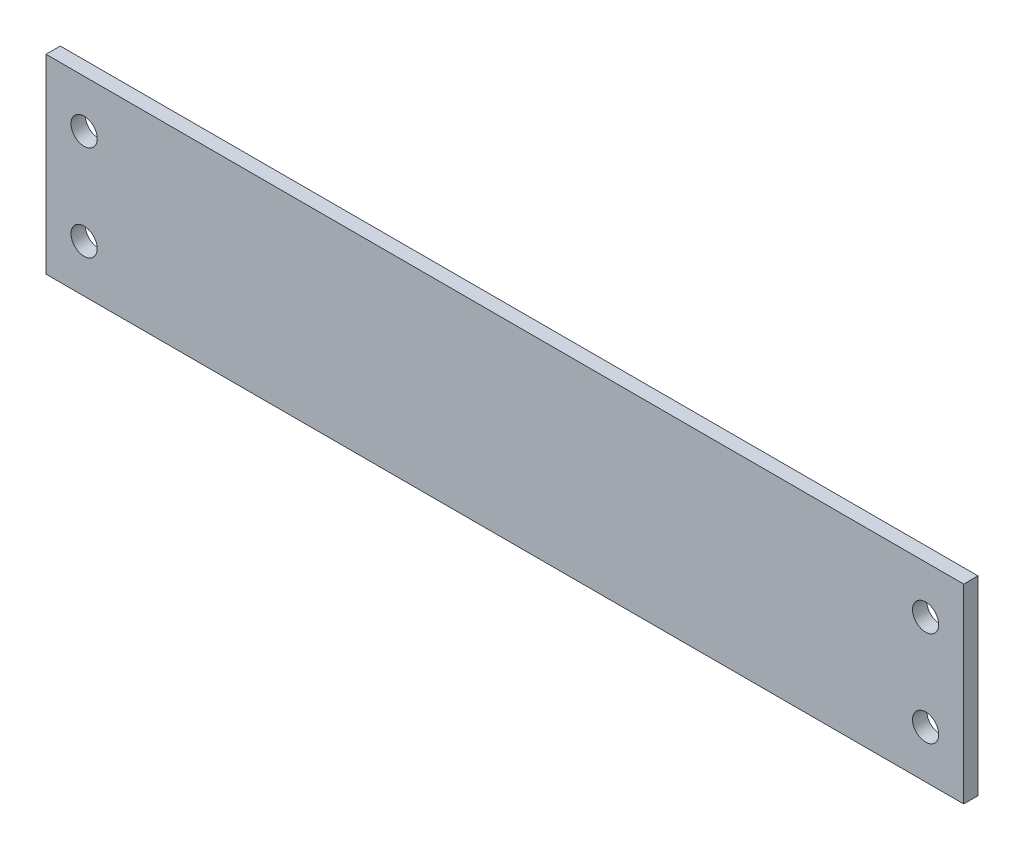
ISO-10303-21;
HEADER;
FILE_DESCRIPTION(('STEP AP214'),'2;1');
FILE_NAME('part.step','',(''),(''),'','','');
FILE_SCHEMA(('AUTOMOTIVE_DESIGN { 1 0 10303 214 1 1 1 1 }'));
ENDSEC;
DATA;
#1=APPLICATION_CONTEXT('core data for automotive mechanical design processes');
#2=APPLICATION_PROTOCOL_DEFINITION('international standard','automotive_design',2000,#1);
#3=PRODUCT_CONTEXT('',#1,'mechanical');
#4=PRODUCT('Part','Part','',(#3));
#5=PRODUCT_RELATED_PRODUCT_CATEGORY('part','',(#4));
#6=PRODUCT_DEFINITION_FORMATION('','',#4);
#7=PRODUCT_DEFINITION_CONTEXT('part definition',#1,'design');
#8=PRODUCT_DEFINITION('design','',#6,#7);
#9=PRODUCT_DEFINITION_SHAPE('','',#8);
#10=(LENGTH_UNIT() NAMED_UNIT(*) SI_UNIT(.MILLI.,.METRE.));
#11=(NAMED_UNIT(*) PLANE_ANGLE_UNIT() SI_UNIT($,.RADIAN.));
#12=(NAMED_UNIT(*) SI_UNIT($,.STERADIAN.) SOLID_ANGLE_UNIT());
#13=UNCERTAINTY_MEASURE_WITH_UNIT(LENGTH_MEASURE(1.E-05),#10,'distance_accuracy_value','');
#14=(GEOMETRIC_REPRESENTATION_CONTEXT(3) GLOBAL_UNCERTAINTY_ASSIGNED_CONTEXT((#13)) GLOBAL_UNIT_ASSIGNED_CONTEXT((#10,
#11,#12)) REPRESENTATION_CONTEXT('',''));
#15=CARTESIAN_POINT('',(0.,0.,0.));
#16=DIRECTION('',(0.,0.,1.));
#17=DIRECTION('',(1.,0.,0.));
#18=AXIS2_PLACEMENT_3D('',#15,#16,#17);
#19=CARTESIAN_POINT('',(-192.75,40.,3.));
#20=DIRECTION('',(0.,-1.,0.));
#21=DIRECTION('',(1.,0.,0.));
#22=AXIS2_PLACEMENT_3D('',#19,#20,#21);
#23=PLANE('',#22);
#24=DIRECTION('',(-1.,0.,0.));
#25=VECTOR('',#24,1.);
#26=CARTESIAN_POINT('',(-192.75,40.,0.));
#27=LINE('',#26,#25);
#28=CARTESIAN_POINT('',(0.,40.,0.));
#29=VERTEX_POINT('',#28);
#30=CARTESIAN_POINT('',(-192.75,40.,0.));
#31=VERTEX_POINT('',#30);
#32=EDGE_CURVE('E97',#29,#31,#27,.T.);
#33=ORIENTED_EDGE('',*,*,#32,.T.);
#34=DIRECTION('',(0.,0.,-1.));
#35=VECTOR('',#34,1.);
#36=CARTESIAN_POINT('',(-192.75,40.,3.));
#37=LINE('',#36,#35);
#38=CARTESIAN_POINT('',(-192.75,40.,3.));
#39=VERTEX_POINT('',#38);
#40=EDGE_CURVE('E11',#39,#31,#37,.T.);
#41=ORIENTED_EDGE('',*,*,#40,.F.);
#42=DIRECTION('',(-1.,0.,0.));
#43=VECTOR('',#42,1.);
#44=CARTESIAN_POINT('',(-192.75,40.,3.));
#45=LINE('',#44,#43);
#46=CARTESIAN_POINT('',(0.,40.,3.));
#47=VERTEX_POINT('',#46);
#48=EDGE_CURVE('E85',#47,#39,#45,.T.);
#49=ORIENTED_EDGE('',*,*,#48,.F.);
#50=DIRECTION('',(0.,0.,-1.));
#51=VECTOR('',#50,1.);
#52=CARTESIAN_POINT('',(0.,40.,3.));
#53=LINE('',#52,#51);
#54=EDGE_CURVE('E93',#47,#29,#53,.T.);
#55=ORIENTED_EDGE('',*,*,#54,.T.);
#56=EDGE_LOOP('',(#33,#41,#49,#55));
#57=FACE_BOUND('',#56,.T.);
#58=ADVANCED_FACE('F34',(#57),#23,.F.);
#59=CARTESIAN_POINT('',(-192.75,40.,3.));
#60=DIRECTION('',(1.,0.,0.));
#61=DIRECTION('',(0.,0.,-1.));
#62=AXIS2_PLACEMENT_3D('',#59,#60,#61);
#63=PLANE('',#62);
#64=DIRECTION('',(0.,-1.,0.));
#65=VECTOR('',#64,1.);
#66=CARTESIAN_POINT('',(-192.75,40.,0.));
#67=LINE('',#66,#65);
#68=CARTESIAN_POINT('',(-192.75,0.,0.));
#69=VERTEX_POINT('',#68);
#70=EDGE_CURVE('E89',#31,#69,#67,.T.);
#71=ORIENTED_EDGE('',*,*,#70,.T.);
#72=DIRECTION('',(0.,0.,-1.));
#73=VECTOR('',#72,1.);
#74=CARTESIAN_POINT('',(-192.75,0.,3.));
#75=LINE('',#74,#73);
#76=CARTESIAN_POINT('',(-192.75,0.,3.));
#77=VERTEX_POINT('',#76);
#78=EDGE_CURVE('E42',#77,#69,#75,.T.);
#79=ORIENTED_EDGE('',*,*,#78,.F.);
#80=DIRECTION('',(0.,-1.,0.));
#81=VECTOR('',#80,1.);
#82=CARTESIAN_POINT('',(-192.75,40.,3.));
#83=LINE('',#82,#81);
#84=EDGE_CURVE('E80',#39,#77,#83,.T.);
#85=ORIENTED_EDGE('',*,*,#84,.F.);
#86=ORIENTED_EDGE('',*,*,#40,.T.);
#87=EDGE_LOOP('',(#71,#79,#85,#86));
#88=FACE_BOUND('',#87,.T.);
#89=ADVANCED_FACE('F88',(#88),#63,.F.);
#90=CARTESIAN_POINT('',(-192.75,0.,3.));
#91=DIRECTION('',(0.,1.,0.));
#92=DIRECTION('',(0.,0.,1.));
#93=AXIS2_PLACEMENT_3D('',#90,#91,#92);
#94=PLANE('',#93);
#95=DIRECTION('',(1.,0.,0.));
#96=VECTOR('',#95,1.);
#97=CARTESIAN_POINT('',(-192.75,0.,0.));
#98=LINE('',#97,#96);
#99=CARTESIAN_POINT('',(0.,0.,0.));
#100=VERTEX_POINT('',#99);
#101=EDGE_CURVE('E67',#69,#100,#98,.T.);
#102=ORIENTED_EDGE('',*,*,#101,.T.);
#103=DIRECTION('',(0.,0.,-1.));
#104=VECTOR('',#103,1.);
#105=CARTESIAN_POINT('',(0.,0.,3.));
#106=LINE('',#105,#104);
#107=CARTESIAN_POINT('',(0.,0.,3.));
#108=VERTEX_POINT('',#107);
#109=EDGE_CURVE('E90',#108,#100,#106,.T.);
#110=ORIENTED_EDGE('',*,*,#109,.F.);
#111=DIRECTION('',(1.,0.,0.));
#112=VECTOR('',#111,1.);
#113=CARTESIAN_POINT('',(-192.75,0.,3.));
#114=LINE('',#113,#112);
#115=EDGE_CURVE('E83',#77,#108,#114,.T.);
#116=ORIENTED_EDGE('',*,*,#115,.F.);
#117=ORIENTED_EDGE('',*,*,#78,.T.);
#118=EDGE_LOOP('',(#102,#110,#116,#117));
#119=FACE_BOUND('',#118,.T.);
#120=ADVANCED_FACE('F91',(#119),#94,.F.);
#121=CARTESIAN_POINT('',(0.,40.,3.));
#122=DIRECTION('',(-1.,0.,0.));
#123=DIRECTION('',(0.,0.,1.));
#124=AXIS2_PLACEMENT_3D('',#121,#122,#123);
#125=PLANE('',#124);
#126=DIRECTION('',(0.,1.,0.));
#127=VECTOR('',#126,1.);
#128=CARTESIAN_POINT('',(0.,40.,0.));
#129=LINE('',#128,#127);
#130=EDGE_CURVE('E73',#100,#29,#129,.T.);
#131=ORIENTED_EDGE('',*,*,#130,.T.);
#132=ORIENTED_EDGE('',*,*,#54,.F.);
#133=DIRECTION('',(0.,1.,0.));
#134=VECTOR('',#133,1.);
#135=CARTESIAN_POINT('',(0.,40.,3.));
#136=LINE('',#135,#134);
#137=EDGE_CURVE('E50',#108,#47,#136,.T.);
#138=ORIENTED_EDGE('',*,*,#137,.F.);
#139=ORIENTED_EDGE('',*,*,#109,.T.);
#140=EDGE_LOOP('',(#131,#132,#138,#139));
#141=FACE_BOUND('',#140,.T.);
#142=ADVANCED_FACE('F105',(#141),#125,.F.);
#143=CARTESIAN_POINT('',(0.,0.,3.));
#144=DIRECTION('',(0.,0.,-1.));
#145=DIRECTION('',(-1.,0.,0.));
#146=AXIS2_PLACEMENT_3D('',#143,#144,#145);
#147=PLANE('',#146);
#148=CARTESIAN_POINT('',(-8.00000000000002,30.,3.));
#149=DIRECTION('',(0.,0.,1.));
#150=DIRECTION('',(1.,0.,0.));
#151=AXIS2_PLACEMENT_3D('',#148,#149,#150);
#152=CIRCLE('',#151,2.75);
#153=CARTESIAN_POINT('',(-5.25000000000002,30.,3.));
#154=VERTEX_POINT('',#153);
#155=EDGE_CURVE('E131',#154,#154,#152,.T.);
#156=ORIENTED_EDGE('',*,*,#155,.F.);
#157=EDGE_LOOP('',(#156));
#158=FACE_BOUND('',#157,.T.);
#159=CARTESIAN_POINT('',(-8.00000000000002,10.,3.));
#160=DIRECTION('',(0.,0.,1.));
#161=DIRECTION('',(1.,0.,0.));
#162=AXIS2_PLACEMENT_3D('',#159,#160,#161);
#163=CIRCLE('',#162,2.75);
#164=CARTESIAN_POINT('',(-5.25000000000002,10.,3.));
#165=VERTEX_POINT('',#164);
#166=EDGE_CURVE('E125',#165,#165,#163,.T.);
#167=ORIENTED_EDGE('',*,*,#166,.F.);
#168=EDGE_LOOP('',(#167));
#169=FACE_BOUND('',#168,.T.);
#170=CARTESIAN_POINT('',(-184.75,30.,3.));
#171=DIRECTION('',(0.,0.,1.));
#172=DIRECTION('',(1.,0.,0.));
#173=AXIS2_PLACEMENT_3D('',#170,#171,#172);
#174=CIRCLE('',#173,2.75);
#175=CARTESIAN_POINT('',(-182.,30.,3.));
#176=VERTEX_POINT('',#175);
#177=EDGE_CURVE('E119',#176,#176,#174,.T.);
#178=ORIENTED_EDGE('',*,*,#177,.F.);
#179=EDGE_LOOP('',(#178));
#180=FACE_BOUND('',#179,.T.);
#181=CARTESIAN_POINT('',(-184.75,10.,3.));
#182=DIRECTION('',(0.,0.,1.));
#183=DIRECTION('',(1.,0.,0.));
#184=AXIS2_PLACEMENT_3D('',#181,#182,#183);
#185=CIRCLE('',#184,2.75);
#186=CARTESIAN_POINT('',(-182.,10.,3.));
#187=VERTEX_POINT('',#186);
#188=EDGE_CURVE('E113',#187,#187,#185,.T.);
#189=ORIENTED_EDGE('',*,*,#188,.F.);
#190=EDGE_LOOP('',(#189));
#191=FACE_BOUND('',#190,.T.);
#192=ORIENTED_EDGE('',*,*,#48,.T.);
#193=ORIENTED_EDGE('',*,*,#84,.T.);
#194=ORIENTED_EDGE('',*,*,#115,.T.);
#195=ORIENTED_EDGE('',*,*,#137,.T.);
#196=EDGE_LOOP('',(#192,#193,#194,#195));
#197=FACE_BOUND('',#196,.T.);
#198=ADVANCED_FACE('F81',(#158,#169,#180,#191,#197),#147,.F.);
#199=CARTESIAN_POINT('',(0.,0.,0.));
#200=DIRECTION('',(0.,0.,-1.));
#201=DIRECTION('',(-1.,0.,0.));
#202=AXIS2_PLACEMENT_3D('',#199,#200,#201);
#203=PLANE('',#202);
#204=CARTESIAN_POINT('',(-8.00000000000002,30.,0.));
#205=DIRECTION('',(0.,0.,1.));
#206=DIRECTION('',(1.,0.,0.));
#207=AXIS2_PLACEMENT_3D('',#204,#205,#206);
#208=CIRCLE('',#207,2.75);
#209=CARTESIAN_POINT('',(-5.25000000000002,30.,0.));
#210=VERTEX_POINT('',#209);
#211=EDGE_CURVE('E128',#210,#210,#208,.T.);
#212=ORIENTED_EDGE('',*,*,#211,.T.);
#213=EDGE_LOOP('',(#212));
#214=FACE_BOUND('',#213,.T.);
#215=CARTESIAN_POINT('',(-8.00000000000002,10.,0.));
#216=DIRECTION('',(0.,0.,1.));
#217=DIRECTION('',(1.,0.,0.));
#218=AXIS2_PLACEMENT_3D('',#215,#216,#217);
#219=CIRCLE('',#218,2.75);
#220=CARTESIAN_POINT('',(-5.25000000000002,10.,0.));
#221=VERTEX_POINT('',#220);
#222=EDGE_CURVE('E122',#221,#221,#219,.T.);
#223=ORIENTED_EDGE('',*,*,#222,.T.);
#224=EDGE_LOOP('',(#223));
#225=FACE_BOUND('',#224,.T.);
#226=CARTESIAN_POINT('',(-184.75,30.,0.));
#227=DIRECTION('',(0.,0.,1.));
#228=DIRECTION('',(1.,0.,0.));
#229=AXIS2_PLACEMENT_3D('',#226,#227,#228);
#230=CIRCLE('',#229,2.75);
#231=CARTESIAN_POINT('',(-182.,30.,0.));
#232=VERTEX_POINT('',#231);
#233=EDGE_CURVE('E116',#232,#232,#230,.T.);
#234=ORIENTED_EDGE('',*,*,#233,.T.);
#235=EDGE_LOOP('',(#234));
#236=FACE_BOUND('',#235,.T.);
#237=CARTESIAN_POINT('',(-184.75,10.,0.));
#238=DIRECTION('',(0.,0.,1.));
#239=DIRECTION('',(1.,0.,0.));
#240=AXIS2_PLACEMENT_3D('',#237,#238,#239);
#241=CIRCLE('',#240,2.75);
#242=CARTESIAN_POINT('',(-182.,10.,0.));
#243=VERTEX_POINT('',#242);
#244=EDGE_CURVE('E100',#243,#243,#241,.T.);
#245=ORIENTED_EDGE('',*,*,#244,.T.);
#246=EDGE_LOOP('',(#245));
#247=FACE_BOUND('',#246,.T.);
#248=ORIENTED_EDGE('',*,*,#32,.F.);
#249=ORIENTED_EDGE('',*,*,#130,.F.);
#250=ORIENTED_EDGE('',*,*,#101,.F.);
#251=ORIENTED_EDGE('',*,*,#70,.F.);
#252=EDGE_LOOP('',(#248,#249,#250,#251));
#253=FACE_BOUND('',#252,.T.);
#254=ADVANCED_FACE('F108',(#214,#225,#236,#247,#253),#203,.T.);
#255=CARTESIAN_POINT('',(-184.75,10.,3.));
#256=DIRECTION('',(0.,0.,1.));
#257=DIRECTION('',(1.,0.,0.));
#258=AXIS2_PLACEMENT_3D('',#255,#256,#257);
#259=CYLINDRICAL_SURFACE('',#258,2.75);
#260=ORIENTED_EDGE('',*,*,#244,.F.);
#261=EDGE_LOOP('',(#260));
#262=FACE_BOUND('',#261,.T.);
#263=ORIENTED_EDGE('',*,*,#188,.T.);
#264=EDGE_LOOP('',(#263));
#265=FACE_BOUND('',#264,.T.);
#266=ADVANCED_FACE('F146',(#262,#265),#259,.F.);
#267=CARTESIAN_POINT('',(-184.75,30.,3.));
#268=DIRECTION('',(0.,0.,1.));
#269=DIRECTION('',(1.,0.,0.));
#270=AXIS2_PLACEMENT_3D('',#267,#268,#269);
#271=CYLINDRICAL_SURFACE('',#270,2.75);
#272=ORIENTED_EDGE('',*,*,#233,.F.);
#273=EDGE_LOOP('',(#272));
#274=FACE_BOUND('',#273,.T.);
#275=ORIENTED_EDGE('',*,*,#177,.T.);
#276=EDGE_LOOP('',(#275));
#277=FACE_BOUND('',#276,.T.);
#278=ADVANCED_FACE('F148',(#274,#277),#271,.F.);
#279=CARTESIAN_POINT('',(-8.00000000000002,10.,3.));
#280=DIRECTION('',(0.,0.,1.));
#281=DIRECTION('',(1.,0.,0.));
#282=AXIS2_PLACEMENT_3D('',#279,#280,#281);
#283=CYLINDRICAL_SURFACE('',#282,2.75);
#284=ORIENTED_EDGE('',*,*,#222,.F.);
#285=EDGE_LOOP('',(#284));
#286=FACE_BOUND('',#285,.T.);
#287=ORIENTED_EDGE('',*,*,#166,.T.);
#288=EDGE_LOOP('',(#287));
#289=FACE_BOUND('',#288,.T.);
#290=ADVANCED_FACE('F155',(#286,#289),#283,.F.);
#291=CARTESIAN_POINT('',(-8.00000000000002,30.,3.));
#292=DIRECTION('',(0.,0.,1.));
#293=DIRECTION('',(1.,0.,0.));
#294=AXIS2_PLACEMENT_3D('',#291,#292,#293);
#295=CYLINDRICAL_SURFACE('',#294,2.75);
#296=ORIENTED_EDGE('',*,*,#211,.F.);
#297=EDGE_LOOP('',(#296));
#298=FACE_BOUND('',#297,.T.);
#299=ORIENTED_EDGE('',*,*,#155,.T.);
#300=EDGE_LOOP('',(#299));
#301=FACE_BOUND('',#300,.T.);
#302=ADVANCED_FACE('F135',(#298,#301),#295,.F.);
#303=CLOSED_SHELL('',(#58,#89,#120,#142,#198,#254,#266,#278,#290,#302));
#304=MANIFOLD_SOLID_BREP('B2',#303);
#305=ADVANCED_BREP_SHAPE_REPRESENTATION('',(#18,#304),#14);
#306=SHAPE_DEFINITION_REPRESENTATION(#9,#305);
ENDSEC;
END-ISO-10303-21;
